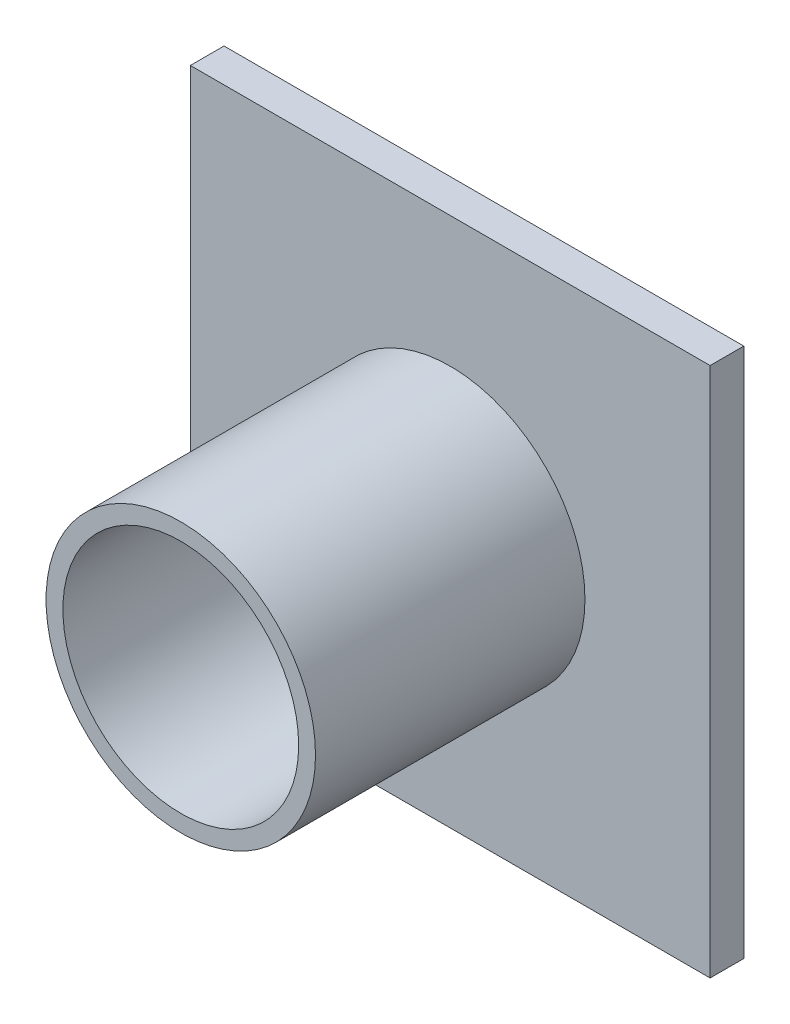
ISO-10303-21;
HEADER;
FILE_DESCRIPTION(('STEP AP214'),'2;1');
FILE_NAME('part.step','',(''),(''),'','','');
FILE_SCHEMA(('AUTOMOTIVE_DESIGN { 1 0 10303 214 1 1 1 1 }'));
ENDSEC;
DATA;
#1=APPLICATION_CONTEXT('core data for automotive mechanical design processes');
#2=APPLICATION_PROTOCOL_DEFINITION('international standard','automotive_design',2000,#1);
#3=PRODUCT_CONTEXT('',#1,'mechanical');
#4=PRODUCT('Part','Part','',(#3));
#5=PRODUCT_RELATED_PRODUCT_CATEGORY('part','',(#4));
#6=PRODUCT_DEFINITION_FORMATION('','',#4);
#7=PRODUCT_DEFINITION_CONTEXT('part definition',#1,'design');
#8=PRODUCT_DEFINITION('design','',#6,#7);
#9=PRODUCT_DEFINITION_SHAPE('','',#8);
#10=(LENGTH_UNIT() NAMED_UNIT(*) SI_UNIT(.MILLI.,.METRE.));
#11=(NAMED_UNIT(*) PLANE_ANGLE_UNIT() SI_UNIT($,.RADIAN.));
#12=(NAMED_UNIT(*) SI_UNIT($,.STERADIAN.) SOLID_ANGLE_UNIT());
#13=UNCERTAINTY_MEASURE_WITH_UNIT(LENGTH_MEASURE(1.E-05),#10,'distance_accuracy_value','');
#14=(GEOMETRIC_REPRESENTATION_CONTEXT(3) GLOBAL_UNCERTAINTY_ASSIGNED_CONTEXT((#13)) GLOBAL_UNIT_ASSIGNED_CONTEXT((#10,
#11,#12)) REPRESENTATION_CONTEXT('',''));
#15=CARTESIAN_POINT('',(0.,0.,0.));
#16=DIRECTION('',(0.,0.,1.));
#17=DIRECTION('',(1.,0.,0.));
#18=AXIS2_PLACEMENT_3D('',#15,#16,#17);
#19=CARTESIAN_POINT('',(-17.8804401154401,0.,6.35));
#20=DIRECTION('',(1.,0.,0.));
#21=DIRECTION('',(0.,0.,-1.));
#22=AXIS2_PLACEMENT_3D('',#19,#20,#21);
#23=PLANE('',#22);
#24=DIRECTION('',(0.,-1.,0.));
#25=VECTOR('',#24,1.);
#26=CARTESIAN_POINT('',(-17.8804401154401,0.,0.));
#27=LINE('',#26,#25);
#28=CARTESIAN_POINT('',(-17.8804401154401,0.,0.));
#29=VERTEX_POINT('',#28);
#30=CARTESIAN_POINT('',(-17.8804401154401,-100.,0.));
#31=VERTEX_POINT('',#30);
#32=EDGE_CURVE('E109',#29,#31,#27,.T.);
#33=ORIENTED_EDGE('',*,*,#32,.T.);
#34=DIRECTION('',(0.,0.,-1.));
#35=VECTOR('',#34,1.);
#36=CARTESIAN_POINT('',(-17.8804401154401,-100.,6.35));
#37=LINE('',#36,#35);
#38=CARTESIAN_POINT('',(-17.8804401154401,-100.,6.35));
#39=VERTEX_POINT('',#38);
#40=EDGE_CURVE('E47',#39,#31,#37,.T.);
#41=ORIENTED_EDGE('',*,*,#40,.F.);
#42=DIRECTION('',(0.,-1.,0.));
#43=VECTOR('',#42,1.);
#44=CARTESIAN_POINT('',(-17.8804401154401,0.,6.35));
#45=LINE('',#44,#43);
#46=CARTESIAN_POINT('',(-17.8804401154401,0.,6.35));
#47=VERTEX_POINT('',#46);
#48=EDGE_CURVE('E91',#47,#39,#45,.T.);
#49=ORIENTED_EDGE('',*,*,#48,.F.);
#50=DIRECTION('',(0.,0.,-1.));
#51=VECTOR('',#50,1.);
#52=CARTESIAN_POINT('',(-17.8804401154401,0.,6.35));
#53=LINE('',#52,#51);
#54=EDGE_CURVE('E105',#47,#29,#53,.T.);
#55=ORIENTED_EDGE('',*,*,#54,.T.);
#56=EDGE_LOOP('',(#33,#41,#49,#55));
#57=FACE_BOUND('',#56,.T.);
#58=ADVANCED_FACE('F38',(#57),#23,.F.);
#59=CARTESIAN_POINT('',(-17.8804401154401,-100.,6.35));
#60=DIRECTION('',(0.,1.,0.));
#61=DIRECTION('',(0.,0.,1.));
#62=AXIS2_PLACEMENT_3D('',#59,#60,#61);
#63=PLANE('',#62);
#64=DIRECTION('',(1.,0.,0.));
#65=VECTOR('',#64,1.);
#66=CARTESIAN_POINT('',(-17.8804401154401,-100.,0.));
#67=LINE('',#66,#65);
#68=CARTESIAN_POINT('',(80.1095598845599,-100.,0.));
#69=VERTEX_POINT('',#68);
#70=EDGE_CURVE('E97',#31,#69,#67,.T.);
#71=ORIENTED_EDGE('',*,*,#70,.T.);
#72=DIRECTION('',(0.,0.,-1.));
#73=VECTOR('',#72,1.);
#74=CARTESIAN_POINT('',(80.1095598845599,-100.,6.35));
#75=LINE('',#74,#73);
#76=CARTESIAN_POINT('',(80.1095598845599,-100.,6.35));
#77=VERTEX_POINT('',#76);
#78=EDGE_CURVE('E95',#77,#69,#75,.T.);
#79=ORIENTED_EDGE('',*,*,#78,.F.);
#80=DIRECTION('',(1.,0.,0.));
#81=VECTOR('',#80,1.);
#82=CARTESIAN_POINT('',(-17.8804401154401,-100.,6.35));
#83=LINE('',#82,#81);
#84=EDGE_CURVE('E86',#39,#77,#83,.T.);
#85=ORIENTED_EDGE('',*,*,#84,.F.);
#86=ORIENTED_EDGE('',*,*,#40,.T.);
#87=EDGE_LOOP('',(#71,#79,#85,#86));
#88=FACE_BOUND('',#87,.T.);
#89=ADVANCED_FACE('F96',(#88),#63,.F.);
#90=CARTESIAN_POINT('',(80.1095598845599,0.,6.35));
#91=DIRECTION('',(-1.,0.,0.));
#92=DIRECTION('',(0.,0.,1.));
#93=AXIS2_PLACEMENT_3D('',#90,#91,#92);
#94=PLANE('',#93);
#95=DIRECTION('',(0.,1.,0.));
#96=VECTOR('',#95,1.);
#97=CARTESIAN_POINT('',(80.1095598845599,0.,0.));
#98=LINE('',#97,#96);
#99=CARTESIAN_POINT('',(80.1095598845599,0.,0.));
#100=VERTEX_POINT('',#99);
#101=EDGE_CURVE('E72',#69,#100,#98,.T.);
#102=ORIENTED_EDGE('',*,*,#101,.T.);
#103=DIRECTION('',(0.,0.,-1.));
#104=VECTOR('',#103,1.);
#105=CARTESIAN_POINT('',(80.1095598845599,0.,6.35));
#106=LINE('',#105,#104);
#107=CARTESIAN_POINT('',(80.1095598845599,0.,6.35));
#108=VERTEX_POINT('',#107);
#109=EDGE_CURVE('E99',#108,#100,#106,.T.);
#110=ORIENTED_EDGE('',*,*,#109,.F.);
#111=DIRECTION('',(0.,1.,0.));
#112=VECTOR('',#111,1.);
#113=CARTESIAN_POINT('',(80.1095598845599,0.,6.35));
#114=LINE('',#113,#112);
#115=EDGE_CURVE('E89',#77,#108,#114,.T.);
#116=ORIENTED_EDGE('',*,*,#115,.F.);
#117=ORIENTED_EDGE('',*,*,#78,.T.);
#118=EDGE_LOOP('',(#102,#110,#116,#117));
#119=FACE_BOUND('',#118,.T.);
#120=ADVANCED_FACE('F101',(#119),#94,.F.);
#121=CARTESIAN_POINT('',(-17.8804401154401,0.,6.35));
#122=DIRECTION('',(0.,-1.,0.));
#123=DIRECTION('',(0.,0.,-1.));
#124=AXIS2_PLACEMENT_3D('',#121,#122,#123);
#125=PLANE('',#124);
#126=DIRECTION('',(-1.,0.,0.));
#127=VECTOR('',#126,1.);
#128=CARTESIAN_POINT('',(-17.8804401154401,0.,0.));
#129=LINE('',#128,#127);
#130=EDGE_CURVE('E78',#100,#29,#129,.T.);
#131=ORIENTED_EDGE('',*,*,#130,.T.);
#132=ORIENTED_EDGE('',*,*,#54,.F.);
#133=DIRECTION('',(-1.,0.,0.));
#134=VECTOR('',#133,1.);
#135=CARTESIAN_POINT('',(-17.8804401154401,0.,6.35));
#136=LINE('',#135,#134);
#137=EDGE_CURVE('E55',#108,#47,#136,.T.);
#138=ORIENTED_EDGE('',*,*,#137,.F.);
#139=ORIENTED_EDGE('',*,*,#109,.T.);
#140=EDGE_LOOP('',(#131,#132,#138,#139));
#141=FACE_BOUND('',#140,.T.);
#142=ADVANCED_FACE('F138',(#141),#125,.F.);
#143=CARTESIAN_POINT('',(0.,0.,6.35));
#144=DIRECTION('',(0.,0.,1.));
#145=DIRECTION('',(1.,0.,0.));
#146=AXIS2_PLACEMENT_3D('',#143,#144,#145);
#147=PLANE('',#146);
#148=CARTESIAN_POINT('',(31.1145598845599,-50.,6.35));
#149=DIRECTION('',(0.,0.,1.));
#150=DIRECTION('',(1.,0.,0.));
#151=AXIS2_PLACEMENT_3D('',#148,#149,#150);
#152=CIRCLE('',#151,25.4);
#153=CARTESIAN_POINT('',(56.5145598845599,-50.,6.35));
#154=VERTEX_POINT('',#153);
#155=EDGE_CURVE('E208',#154,#154,#152,.T.);
#156=ORIENTED_EDGE('',*,*,#155,.F.);
#157=EDGE_LOOP('',(#156));
#158=FACE_BOUND('',#157,.T.);
#159=ORIENTED_EDGE('',*,*,#48,.T.);
#160=ORIENTED_EDGE('',*,*,#84,.T.);
#161=ORIENTED_EDGE('',*,*,#115,.T.);
#162=ORIENTED_EDGE('',*,*,#137,.T.);
#163=EDGE_LOOP('',(#159,#160,#161,#162));
#164=FACE_BOUND('',#163,.T.);
#165=ADVANCED_FACE('F87',(#158,#164),#147,.T.);
#166=CARTESIAN_POINT('',(0.,0.,0.));
#167=DIRECTION('',(0.,0.,1.));
#168=DIRECTION('',(1.,0.,0.));
#169=AXIS2_PLACEMENT_3D('',#166,#167,#168);
#170=PLANE('',#169);
#171=ORIENTED_EDGE('',*,*,#32,.F.);
#172=ORIENTED_EDGE('',*,*,#130,.F.);
#173=ORIENTED_EDGE('',*,*,#101,.F.);
#174=ORIENTED_EDGE('',*,*,#70,.F.);
#175=EDGE_LOOP('',(#171,#172,#173,#174));
#176=FACE_BOUND('',#175,.T.);
#177=ADVANCED_FACE('F127',(#176),#170,.F.);
#178=CARTESIAN_POINT('',(31.1145598845599,-50.,57.15));
#179=DIRECTION('',(0.,0.,1.));
#180=DIRECTION('',(1.,0.,0.));
#181=AXIS2_PLACEMENT_3D('',#178,#179,#180);
#182=PLANE('',#181);
#183=CARTESIAN_POINT('',(31.1145598845599,-50.,57.15));
#184=DIRECTION('',(0.,0.,1.));
#185=DIRECTION('',(1.,0.,0.));
#186=AXIS2_PLACEMENT_3D('',#183,#184,#185);
#187=CIRCLE('',#186,25.4);
#188=CARTESIAN_POINT('',(56.5145598845599,-50.,57.15));
#189=VERTEX_POINT('',#188);
#190=EDGE_CURVE('E113',#189,#189,#187,.T.);
#191=ORIENTED_EDGE('',*,*,#190,.T.);
#192=EDGE_LOOP('',(#191));
#193=FACE_BOUND('',#192,.T.);
#194=CARTESIAN_POINT('',(31.1145598845599,-50.,57.15));
#195=DIRECTION('',(0.,0.,1.));
#196=DIRECTION('',(1.,0.,0.));
#197=AXIS2_PLACEMENT_3D('',#194,#195,#196);
#198=CIRCLE('',#197,22.225);
#199=CARTESIAN_POINT('',(53.3395598845599,-50.,57.15));
#200=VERTEX_POINT('',#199);
#201=EDGE_CURVE('E205',#200,#200,#198,.T.);
#202=ORIENTED_EDGE('',*,*,#201,.F.);
#203=EDGE_LOOP('',(#202));
#204=FACE_BOUND('',#203,.T.);
#205=ADVANCED_FACE('F129',(#193,#204),#182,.T.);
#206=CARTESIAN_POINT('',(31.1145598845599,-50.,57.15));
#207=DIRECTION('',(0.,0.,-1.));
#208=DIRECTION('',(-1.,0.,0.));
#209=AXIS2_PLACEMENT_3D('',#206,#207,#208);
#210=CYLINDRICAL_SURFACE('',#209,25.4);
#211=ORIENTED_EDGE('',*,*,#190,.F.);
#212=EDGE_LOOP('',(#211));
#213=FACE_BOUND('',#212,.T.);
#214=ORIENTED_EDGE('',*,*,#155,.T.);
#215=EDGE_LOOP('',(#214));
#216=FACE_BOUND('',#215,.T.);
#217=ADVANCED_FACE('F135',(#213,#216),#210,.T.);
#218=CARTESIAN_POINT('',(31.1145598845599,-50.,57.15));
#219=DIRECTION('',(0.,0.,-1.));
#220=DIRECTION('',(-1.,0.,0.));
#221=AXIS2_PLACEMENT_3D('',#218,#219,#220);
#222=CYLINDRICAL_SURFACE('',#221,22.225);
#223=ORIENTED_EDGE('',*,*,#201,.T.);
#224=EDGE_LOOP('',(#223));
#225=FACE_BOUND('',#224,.T.);
#226=CARTESIAN_POINT('',(31.1145598845599,-50.,6.35));
#227=DIRECTION('',(0.,0.,1.));
#228=DIRECTION('',(1.,0.,0.));
#229=AXIS2_PLACEMENT_3D('',#226,#227,#228);
#230=CIRCLE('',#229,22.225);
#231=CARTESIAN_POINT('',(53.3395598845599,-50.,6.35));
#232=VERTEX_POINT('',#231);
#233=EDGE_CURVE('E11',#232,#232,#230,.F.);
#234=ORIENTED_EDGE('',*,*,#233,.T.);
#235=EDGE_LOOP('',(#234));
#236=FACE_BOUND('',#235,.T.);
#237=ADVANCED_FACE('F178',(#225,#236),#222,.F.);
#238=ORIENTED_EDGE('',*,*,#233,.F.);
#239=EDGE_LOOP('',(#238));
#240=FACE_BOUND('',#239,.T.);
#241=ADVANCED_FACE('F141',(#240),#147,.T.);
#242=CLOSED_SHELL('',(#58,#89,#120,#142,#165,#177,#205,#217,#237,#241));
#243=MANIFOLD_SOLID_BREP('B2',#242);
#244=ADVANCED_BREP_SHAPE_REPRESENTATION('',(#18,#243),#14);
#245=SHAPE_DEFINITION_REPRESENTATION(#9,#244);
ENDSEC;
END-ISO-10303-21;
